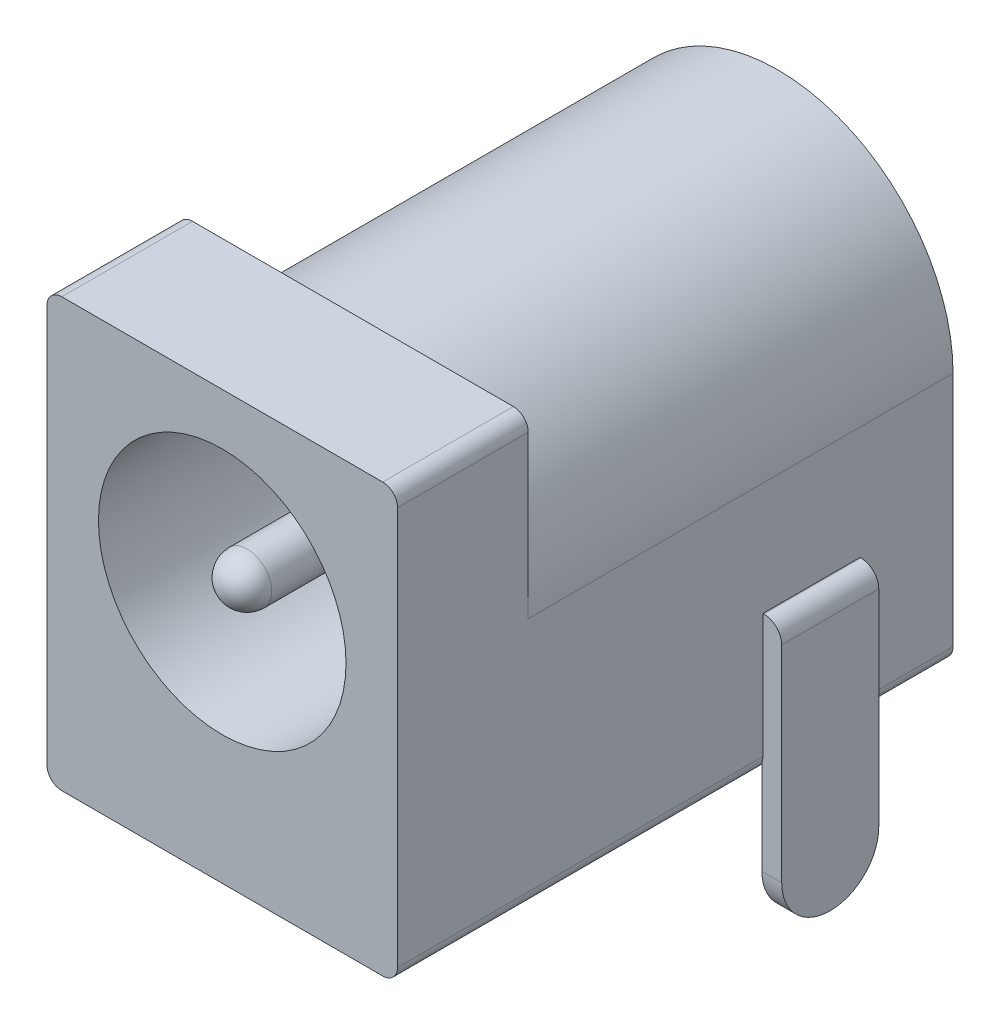
ISO-10303-21;
HEADER;
FILE_DESCRIPTION(('STEP AP214'),'2;1');
FILE_NAME('part.step','',(''),(''),'','','');
FILE_SCHEMA(('AUTOMOTIVE_DESIGN { 1 0 10303 214 1 1 1 1 }'));
ENDSEC;
DATA;
#1=APPLICATION_CONTEXT('core data for automotive mechanical design processes');
#2=APPLICATION_PROTOCOL_DEFINITION('international standard','automotive_design',2000,#1);
#3=PRODUCT_CONTEXT('',#1,'mechanical');
#4=PRODUCT('Part','Part','',(#3));
#5=PRODUCT_RELATED_PRODUCT_CATEGORY('part','',(#4));
#6=PRODUCT_DEFINITION_FORMATION('','',#4);
#7=PRODUCT_DEFINITION_CONTEXT('part definition',#1,'design');
#8=PRODUCT_DEFINITION('design','',#6,#7);
#9=PRODUCT_DEFINITION_SHAPE('','',#8);
#10=(LENGTH_UNIT() NAMED_UNIT(*) SI_UNIT(.MILLI.,.METRE.));
#11=(NAMED_UNIT(*) PLANE_ANGLE_UNIT() SI_UNIT($,.RADIAN.));
#12=(NAMED_UNIT(*) SI_UNIT($,.STERADIAN.) SOLID_ANGLE_UNIT());
#13=UNCERTAINTY_MEASURE_WITH_UNIT(LENGTH_MEASURE(1.E-05),#10,'distance_accuracy_value','');
#14=(GEOMETRIC_REPRESENTATION_CONTEXT(3) GLOBAL_UNCERTAINTY_ASSIGNED_CONTEXT((#13)) GLOBAL_UNIT_ASSIGNED_CONTEXT((#10,
#11,#12)) REPRESENTATION_CONTEXT('',''));
#15=CARTESIAN_POINT('',(0.,0.,0.));
#16=DIRECTION('',(0.,0.,1.));
#17=DIRECTION('',(1.,0.,0.));
#18=AXIS2_PLACEMENT_3D('',#15,#16,#17);
#19=CARTESIAN_POINT('',(8.9662,-3.683,2.3876));
#20=DIRECTION('',(-1.,0.,0.));
#21=DIRECTION('',(0.,0.,1.));
#22=AXIS2_PLACEMENT_3D('',#19,#20,#21);
#23=PLANE('',#22);
#24=DIRECTION('',(0.,1.,0.));
#25=VECTOR('',#24,1.);
#26=CARTESIAN_POINT('',(8.9662,-3.683,2.3876));
#27=LINE('',#26,#25);
#28=CARTESIAN_POINT('',(8.96619999999999,-2.1844,2.3876));
#29=VERTEX_POINT('',#28);
#30=CARTESIAN_POINT('',(8.9662,0.244216813898783,2.3876));
#31=VERTEX_POINT('',#30);
#32=EDGE_CURVE('E229',#29,#31,#27,.T.);
#33=ORIENTED_EDGE('',*,*,#32,.F.);
#34=CARTESIAN_POINT('',(8.96619999999999,-2.1844,3.6322));
#35=DIRECTION('',(1.,0.,0.));
#36=DIRECTION('',(0.,0.,-1.));
#37=AXIS2_PLACEMENT_3D('',#34,#35,#36);
#38=CIRCLE('',#37,1.2446);
#39=CARTESIAN_POINT('',(8.96619999999999,-2.1844,4.8768));
#40=VERTEX_POINT('',#39);
#41=EDGE_CURVE('E216',#40,#29,#38,.T.);
#42=ORIENTED_EDGE('',*,*,#41,.F.);
#43=DIRECTION('',(0.,1.,0.));
#44=VECTOR('',#43,1.);
#45=CARTESIAN_POINT('',(8.9662,-3.683,4.8768));
#46=LINE('',#45,#44);
#47=CARTESIAN_POINT('',(8.9662,0.244216813898783,4.8768));
#48=VERTEX_POINT('',#47);
#49=EDGE_CURVE('E249',#40,#48,#46,.T.);
#50=ORIENTED_EDGE('',*,*,#49,.T.);
#51=DIRECTION('',(0.,0.,-1.));
#52=VECTOR('',#51,1.);
#53=CARTESIAN_POINT('',(8.9662,0.244216813898783,14.2494));
#54=LINE('',#53,#52);
#55=EDGE_CURVE('E236',#31,#48,#54,.F.);
#56=ORIENTED_EDGE('',*,*,#55,.F.);
#57=EDGE_LOOP('',(#33,#42,#50,#56));
#58=FACE_BOUND('',#57,.T.);
#59=ADVANCED_FACE('F40',(#58),#23,.T.);
#60=CARTESIAN_POINT('',(8.9662,-3.683,2.3876));
#61=DIRECTION('',(0.,0.,1.));
#62=DIRECTION('',(1.,0.,0.));
#63=AXIS2_PLACEMENT_3D('',#60,#61,#62);
#64=PLANE('',#63);
#65=DIRECTION('',(1.,0.,0.));
#66=VECTOR('',#65,1.);
#67=CARTESIAN_POINT('',(8.96619999999999,-2.1844,2.3876));
#68=LINE('',#67,#66);
#69=CARTESIAN_POINT('',(9.47419999999999,-2.1844,2.3876));
#70=VERTEX_POINT('',#69);
#71=EDGE_CURVE('E55',#29,#70,#68,.T.);
#72=ORIENTED_EDGE('',*,*,#71,.F.);
#73=ORIENTED_EDGE('',*,*,#32,.T.);
#74=CARTESIAN_POINT('',(8.6106,0.380999999999999,2.3876));
#75=DIRECTION('',(0.,0.,1.));
#76=DIRECTION('',(1.,0.,0.));
#77=AXIS2_PLACEMENT_3D('',#74,#75,#76);
#78=CIRCLE('',#77,0.380999999999999);
#79=CARTESIAN_POINT('',(8.99159999999999,0.380999999999999,2.3876));
#80=VERTEX_POINT('',#79);
#81=EDGE_CURVE('E240',#31,#80,#78,.T.);
#82=ORIENTED_EDGE('',*,*,#81,.T.);
#83=DIRECTION('',(0.,-1.,0.));
#84=VECTOR('',#83,1.);
#85=CARTESIAN_POINT('',(8.9916,10.5918,2.3876));
#86=LINE('',#85,#84);
#87=CARTESIAN_POINT('',(8.9916,3.556,2.3876));
#88=VERTEX_POINT('',#87);
#89=EDGE_CURVE('E347',#88,#80,#86,.T.);
#90=ORIENTED_EDGE('',*,*,#89,.F.);
#91=DIRECTION('',(1.,0.,0.));
#92=VECTOR('',#91,1.);
#93=CARTESIAN_POINT('',(8.9662,3.556,2.3876));
#94=LINE('',#93,#92);
#95=CARTESIAN_POINT('',(9.017,3.556,2.3876));
#96=VERTEX_POINT('',#95);
#97=EDGE_CURVE('E245',#88,#96,#94,.T.);
#98=ORIENTED_EDGE('',*,*,#97,.T.);
#99=CARTESIAN_POINT('',(9.017,3.0988,2.3876));
#100=DIRECTION('',(0.,0.,1.));
#101=DIRECTION('',(1.,0.,0.));
#102=AXIS2_PLACEMENT_3D('',#99,#100,#101);
#103=CIRCLE('',#102,0.4572);
#104=CARTESIAN_POINT('',(9.47419999999999,3.0988,2.3876));
#105=VERTEX_POINT('',#104);
#106=EDGE_CURVE('E383',#96,#105,#103,.F.);
#107=ORIENTED_EDGE('',*,*,#106,.T.);
#108=DIRECTION('',(0.,1.,0.));
#109=VECTOR('',#108,1.);
#110=CARTESIAN_POINT('',(9.47419999999999,-3.683,2.3876));
#111=LINE('',#110,#109);
#112=EDGE_CURVE('E232',#70,#105,#111,.T.);
#113=ORIENTED_EDGE('',*,*,#112,.F.);
#114=EDGE_LOOP('',(#72,#73,#82,#90,#98,#107,#113));
#115=FACE_BOUND('',#114,.T.);
#116=ADVANCED_FACE('F227',(#115),#64,.F.);
#117=CARTESIAN_POINT('',(9.47419999999999,-3.683,4.8768));
#118=DIRECTION('',(1.,0.,0.));
#119=DIRECTION('',(0.,0.,-1.));
#120=AXIS2_PLACEMENT_3D('',#117,#118,#119);
#121=PLANE('',#120);
#122=DIRECTION('',(0.,1.,0.));
#123=VECTOR('',#122,1.);
#124=CARTESIAN_POINT('',(9.47419999999999,-3.683,4.8768));
#125=LINE('',#124,#123);
#126=CARTESIAN_POINT('',(9.47419999999999,-2.1844,4.8768));
#127=VERTEX_POINT('',#126);
#128=CARTESIAN_POINT('',(9.47419999999999,3.0988,4.8768));
#129=VERTEX_POINT('',#128);
#130=EDGE_CURVE('E242',#127,#129,#125,.T.);
#131=ORIENTED_EDGE('',*,*,#130,.F.);
#132=CARTESIAN_POINT('',(9.47419999999999,-2.1844,3.6322));
#133=DIRECTION('',(1.,0.,0.));
#134=DIRECTION('',(0.,0.,-1.));
#135=AXIS2_PLACEMENT_3D('',#132,#133,#134);
#136=CIRCLE('',#135,1.2446);
#137=EDGE_CURVE('E223',#127,#70,#136,.T.);
#138=ORIENTED_EDGE('',*,*,#137,.T.);
#139=ORIENTED_EDGE('',*,*,#112,.T.);
#140=DIRECTION('',(0.,0.,-1.));
#141=VECTOR('',#140,1.);
#142=CARTESIAN_POINT('',(9.47419999999999,3.0988,4.8768));
#143=LINE('',#142,#141);
#144=EDGE_CURVE('E385',#105,#129,#143,.F.);
#145=ORIENTED_EDGE('',*,*,#144,.T.);
#146=EDGE_LOOP('',(#131,#138,#139,#145));
#147=FACE_BOUND('',#146,.T.);
#148=ADVANCED_FACE('F444',(#147),#121,.T.);
#149=CARTESIAN_POINT('',(5.7404,-3.683,7.0104));
#150=DIRECTION('',(1.,0.,0.));
#151=DIRECTION('',(0.,0.,-1.));
#152=AXIS2_PLACEMENT_3D('',#149,#150,#151);
#153=PLANE('',#152);
#154=DIRECTION('',(0.,1.,0.));
#155=VECTOR('',#154,1.);
#156=CARTESIAN_POINT('',(5.7404,-3.683,7.0104));
#157=LINE('',#156,#155);
#158=CARTESIAN_POINT('',(5.7404,-2.1844,7.0104));
#159=VERTEX_POINT('',#158);
#160=CARTESIAN_POINT('',(5.7404,0.,7.0104));
#161=VERTEX_POINT('',#160);
#162=EDGE_CURVE('E474',#159,#161,#157,.T.);
#163=ORIENTED_EDGE('',*,*,#162,.F.);
#164=DIRECTION('',(0.,0.,-1.));
#165=VECTOR('',#164,1.);
#166=CARTESIAN_POINT('',(5.7404,-2.1844,7.26440000002886));
#167=LINE('',#166,#165);
#168=CARTESIAN_POINT('',(5.7404,-2.1844,6.75640000002886));
#169=VERTEX_POINT('',#168);
#170=EDGE_CURVE('E62',#159,#169,#167,.T.);
#171=ORIENTED_EDGE('',*,*,#170,.T.);
#172=DIRECTION('',(0.,1.,0.));
#173=VECTOR('',#172,1.);
#174=CARTESIAN_POINT('',(5.7404,-3.683,6.7564));
#175=LINE('',#174,#173);
#176=CARTESIAN_POINT('',(5.7404,0.,6.7564));
#177=VERTEX_POINT('',#176);
#178=EDGE_CURVE('E472',#169,#177,#175,.T.);
#179=ORIENTED_EDGE('',*,*,#178,.T.);
#180=DIRECTION('',(0.,0.,-1.));
#181=VECTOR('',#180,1.);
#182=CARTESIAN_POINT('',(5.74040000000005,0.,14.2494));
#183=LINE('',#182,#181);
#184=EDGE_CURVE('E374',#161,#177,#183,.T.);
#185=ORIENTED_EDGE('',*,*,#184,.F.);
#186=EDGE_LOOP('',(#163,#171,#179,#185));
#187=FACE_BOUND('',#186,.T.);
#188=ADVANCED_FACE('F606',(#187),#153,.T.);
#189=CARTESIAN_POINT('',(3.2512,-3.683,6.7564));
#190=DIRECTION('',(0.,0.,1.));
#191=DIRECTION('',(1.,0.,0.));
#192=AXIS2_PLACEMENT_3D('',#189,#190,#191);
#193=PLANE('',#192);
#194=CARTESIAN_POINT('',(4.4958,-2.1844,6.75640000002886));
#195=DIRECTION('',(0.,0.,-1.));
#196=DIRECTION('',(-1.,0.,0.));
#197=AXIS2_PLACEMENT_3D('',#194,#195,#196);
#198=CIRCLE('',#197,1.2446);
#199=CARTESIAN_POINT('',(3.2512,-2.1844,6.75640000002886));
#200=VERTEX_POINT('',#199);
#201=EDGE_CURVE('E441',#169,#200,#198,.T.);
#202=ORIENTED_EDGE('',*,*,#201,.T.);
#203=DIRECTION('',(0.,1.,0.));
#204=VECTOR('',#203,1.);
#205=CARTESIAN_POINT('',(3.2512,-3.683,6.7564));
#206=LINE('',#205,#204);
#207=CARTESIAN_POINT('',(3.2512,0.,6.7564));
#208=VERTEX_POINT('',#207);
#209=EDGE_CURVE('E469',#200,#208,#206,.T.);
#210=ORIENTED_EDGE('',*,*,#209,.T.);
#211=DIRECTION('',(1.,0.,0.));
#212=VECTOR('',#211,1.);
#213=CARTESIAN_POINT('',(0.381,0.,6.7564));
#214=LINE('',#213,#212);
#215=EDGE_CURVE('E479',#208,#177,#214,.T.);
#216=ORIENTED_EDGE('',*,*,#215,.T.);
#217=ORIENTED_EDGE('',*,*,#178,.F.);
#218=EDGE_LOOP('',(#202,#210,#216,#217));
#219=FACE_BOUND('',#218,.T.);
#220=ADVANCED_FACE('F595',(#219),#193,.F.);
#221=CARTESIAN_POINT('',(5.7404,-3.683,7.0104));
#222=DIRECTION('',(0.,0.,-1.));
#223=DIRECTION('',(-1.,0.,0.));
#224=AXIS2_PLACEMENT_3D('',#221,#222,#223);
#225=PLANE('',#224);
#226=CARTESIAN_POINT('',(4.4958,-2.1844,7.0104));
#227=DIRECTION('',(0.,0.,-1.));
#228=DIRECTION('',(-1.,0.,0.));
#229=AXIS2_PLACEMENT_3D('',#226,#227,#228);
#230=CIRCLE('',#229,1.2446);
#231=CARTESIAN_POINT('',(3.2512,-2.1844,7.0104));
#232=VERTEX_POINT('',#231);
#233=EDGE_CURVE('E12',#159,#232,#230,.T.);
#234=ORIENTED_EDGE('',*,*,#233,.F.);
#235=ORIENTED_EDGE('',*,*,#162,.T.);
#236=DIRECTION('',(-1.,0.,0.));
#237=VECTOR('',#236,1.);
#238=CARTESIAN_POINT('',(0.381,0.,7.0104));
#239=LINE('',#238,#237);
#240=CARTESIAN_POINT('',(3.2512,0.,7.0104));
#241=VERTEX_POINT('',#240);
#242=EDGE_CURVE('E471',#161,#241,#239,.T.);
#243=ORIENTED_EDGE('',*,*,#242,.T.);
#244=DIRECTION('',(0.,1.,0.));
#245=VECTOR('',#244,1.);
#246=CARTESIAN_POINT('',(3.2512,-3.683,7.0104));
#247=LINE('',#246,#245);
#248=EDGE_CURVE('E468',#232,#241,#247,.T.);
#249=ORIENTED_EDGE('',*,*,#248,.F.);
#250=EDGE_LOOP('',(#234,#235,#243,#249));
#251=FACE_BOUND('',#250,.T.);
#252=ADVANCED_FACE('F603',(#251),#225,.F.);
#253=CARTESIAN_POINT('',(2.9972,-3.683,0.381000000000002));
#254=DIRECTION('',(0.,0.,1.));
#255=DIRECTION('',(1.,0.,0.));
#256=AXIS2_PLACEMENT_3D('',#253,#254,#255);
#257=PLANE('',#256);
#258=CARTESIAN_POINT('',(4.4958,-1.9304,0.381000000000002));
#259=DIRECTION('',(0.,0.,-1.));
#260=DIRECTION('',(-1.,0.,0.));
#261=AXIS2_PLACEMENT_3D('',#258,#259,#260);
#262=CIRCLE('',#261,1.4986);
#263=CARTESIAN_POINT('',(5.9944,-1.9304,0.381000000000002));
#264=VERTEX_POINT('',#263);
#265=CARTESIAN_POINT('',(2.9972,-1.9304,0.381000000000002));
#266=VERTEX_POINT('',#265);
#267=EDGE_CURVE('E452',#264,#266,#262,.T.);
#268=ORIENTED_EDGE('',*,*,#267,.T.);
#269=DIRECTION('',(0.,1.,0.));
#270=VECTOR('',#269,1.);
#271=CARTESIAN_POINT('',(2.9972,-3.683,0.381000000000002));
#272=LINE('',#271,#270);
#273=CARTESIAN_POINT('',(2.9972,0.,0.381000000000002));
#274=VERTEX_POINT('',#273);
#275=EDGE_CURVE('E401',#266,#274,#272,.T.);
#276=ORIENTED_EDGE('',*,*,#275,.T.);
#277=DIRECTION('',(1.,0.,0.));
#278=VECTOR('',#277,1.);
#279=CARTESIAN_POINT('',(0.381,0.,0.381000000000002));
#280=LINE('',#279,#278);
#281=CARTESIAN_POINT('',(5.9944,0.,0.381000000000002));
#282=VERTEX_POINT('',#281);
#283=EDGE_CURVE('E356',#274,#282,#280,.T.);
#284=ORIENTED_EDGE('',*,*,#283,.T.);
#285=DIRECTION('',(0.,1.,0.));
#286=VECTOR('',#285,1.);
#287=CARTESIAN_POINT('',(5.9944,-3.683,0.381000000000002));
#288=LINE('',#287,#286);
#289=EDGE_CURVE('E484',#264,#282,#288,.T.);
#290=ORIENTED_EDGE('',*,*,#289,.F.);
#291=EDGE_LOOP('',(#268,#276,#284,#290));
#292=FACE_BOUND('',#291,.T.);
#293=ADVANCED_FACE('F508',(#292),#257,.F.);
#294=CARTESIAN_POINT('',(5.9944,-3.683,0.889000000000002));
#295=DIRECTION('',(1.,0.,0.));
#296=DIRECTION('',(0.,0.,-1.));
#297=AXIS2_PLACEMENT_3D('',#294,#295,#296);
#298=PLANE('',#297);
#299=DIRECTION('',(0.,1.,0.));
#300=VECTOR('',#299,1.);
#301=CARTESIAN_POINT('',(5.9944,-3.683,0.889000000000002));
#302=LINE('',#301,#300);
#303=CARTESIAN_POINT('',(5.9944,-1.9304,0.889000000000002));
#304=VERTEX_POINT('',#303);
#305=CARTESIAN_POINT('',(5.9944,0.,0.889000000000002));
#306=VERTEX_POINT('',#305);
#307=EDGE_CURVE('E486',#304,#306,#302,.T.);
#308=ORIENTED_EDGE('',*,*,#307,.F.);
#309=DIRECTION('',(0.,0.,-1.));
#310=VECTOR('',#309,1.);
#311=CARTESIAN_POINT('',(5.9944,-1.9304,0.889000000000003));
#312=LINE('',#311,#310);
#313=EDGE_CURVE('E455',#304,#264,#312,.T.);
#314=ORIENTED_EDGE('',*,*,#313,.T.);
#315=ORIENTED_EDGE('',*,*,#289,.T.);
#316=DIRECTION('',(0.,0.,-1.));
#317=VECTOR('',#316,1.);
#318=CARTESIAN_POINT('',(5.9944,0.,14.2494));
#319=LINE('',#318,#317);
#320=EDGE_CURVE('E353',#306,#282,#319,.T.);
#321=ORIENTED_EDGE('',*,*,#320,.F.);
#322=EDGE_LOOP('',(#308,#314,#315,#321));
#323=FACE_BOUND('',#322,.T.);
#324=ADVANCED_FACE('F505',(#323),#298,.T.);
#325=CARTESIAN_POINT('',(5.9944,-3.683,0.889000000000002));
#326=DIRECTION('',(0.,0.,-1.));
#327=DIRECTION('',(-1.,0.,0.));
#328=AXIS2_PLACEMENT_3D('',#325,#326,#327);
#329=PLANE('',#328);
#330=CARTESIAN_POINT('',(4.4958,-1.9304,0.889000000000003));
#331=DIRECTION('',(0.,0.,-1.));
#332=DIRECTION('',(-1.,0.,0.));
#333=AXIS2_PLACEMENT_3D('',#330,#331,#332);
#334=CIRCLE('',#333,1.4986);
#335=CARTESIAN_POINT('',(2.9972,-1.9304,0.889000000000003));
#336=VERTEX_POINT('',#335);
#337=EDGE_CURVE('E453',#304,#336,#334,.T.);
#338=ORIENTED_EDGE('',*,*,#337,.F.);
#339=ORIENTED_EDGE('',*,*,#307,.T.);
#340=DIRECTION('',(-1.,0.,0.));
#341=VECTOR('',#340,1.);
#342=CARTESIAN_POINT('',(0.380999999999999,0.,0.889000000000003));
#343=LINE('',#342,#341);
#344=CARTESIAN_POINT('',(2.9972,0.,0.889000000000003));
#345=VERTEX_POINT('',#344);
#346=EDGE_CURVE('E350',#306,#345,#343,.T.);
#347=ORIENTED_EDGE('',*,*,#346,.T.);
#348=DIRECTION('',(0.,1.,0.));
#349=VECTOR('',#348,1.);
#350=CARTESIAN_POINT('',(2.9972,-3.683,0.889000000000003));
#351=LINE('',#350,#349);
#352=EDGE_CURVE('E482',#336,#345,#351,.T.);
#353=ORIENTED_EDGE('',*,*,#352,.F.);
#354=EDGE_LOOP('',(#338,#339,#347,#353));
#355=FACE_BOUND('',#354,.T.);
#356=ADVANCED_FACE('F502',(#355),#329,.F.);
#357=CARTESIAN_POINT('',(4.4958,6.477,2.54));
#358=DIRECTION('',(0.,0.,1.));
#359=DIRECTION('',(1.,0.,0.));
#360=AXIS2_PLACEMENT_3D('',#357,#358,#359);
#361=CYLINDRICAL_SURFACE('',#360,3.175);
#362=CARTESIAN_POINT('',(4.4958,6.477,14.2494));
#363=DIRECTION('',(0.,0.,1.));
#364=DIRECTION('',(1.,0.,0.));
#365=AXIS2_PLACEMENT_3D('',#362,#363,#364);
#366=CIRCLE('',#365,3.175);
#367=CARTESIAN_POINT('',(7.6708,6.477,14.2494));
#368=VERTEX_POINT('',#367);
#369=EDGE_CURVE('E276',#368,#368,#366,.T.);
#370=ORIENTED_EDGE('',*,*,#369,.T.);
#371=EDGE_LOOP('',(#370));
#372=FACE_BOUND('',#371,.T.);
#373=CARTESIAN_POINT('',(4.4958,6.477,2.54));
#374=DIRECTION('',(0.,0.,1.));
#375=DIRECTION('',(1.,0.,0.));
#376=AXIS2_PLACEMENT_3D('',#373,#374,#375);
#377=CIRCLE('',#376,3.175);
#378=CARTESIAN_POINT('',(7.6708,6.477,2.54));
#379=VERTEX_POINT('',#378);
#380=EDGE_CURVE('E277',#379,#379,#377,.T.);
#381=ORIENTED_EDGE('',*,*,#380,.F.);
#382=EDGE_LOOP('',(#381));
#383=FACE_BOUND('',#382,.T.);
#384=DIRECTION('',(0.,0.,1.));
#385=VECTOR('',#384,1.);
#386=CARTESIAN_POINT('',(5.74014078933385,3.556,2.54));
#387=LINE('',#386,#385);
#388=CARTESIAN_POINT('',(5.74014078933385,3.556,7.0104));
#389=VERTEX_POINT('',#388);
#390=CARTESIAN_POINT('',(5.74014078933385,3.556,6.7564));
#391=VERTEX_POINT('',#390);
#392=EDGE_CURVE('E371',#389,#391,#387,.F.);
#393=ORIENTED_EDGE('',*,*,#392,.F.);
#394=CARTESIAN_POINT('',(4.4958,6.477,7.0104));
#395=DIRECTION('',(0.,0.,-1.));
#396=DIRECTION('',(-1.,0.,0.));
#397=AXIS2_PLACEMENT_3D('',#394,#395,#396);
#398=CIRCLE('',#397,3.175);
#399=CARTESIAN_POINT('',(3.25145921066615,3.556,7.0104));
#400=VERTEX_POINT('',#399);
#401=EDGE_CURVE('E365',#400,#389,#398,.F.);
#402=ORIENTED_EDGE('',*,*,#401,.F.);
#403=DIRECTION('',(0.,0.,1.));
#404=VECTOR('',#403,1.);
#405=CARTESIAN_POINT('',(3.25145921066615,3.556,2.54));
#406=LINE('',#405,#404);
#407=CARTESIAN_POINT('',(3.25145921066615,3.556,6.7564));
#408=VERTEX_POINT('',#407);
#409=EDGE_CURVE('E362',#408,#400,#406,.T.);
#410=ORIENTED_EDGE('',*,*,#409,.F.);
#411=CARTESIAN_POINT('',(4.4958,6.477,6.7564));
#412=DIRECTION('',(0.,0.,1.));
#413=DIRECTION('',(1.,0.,0.));
#414=AXIS2_PLACEMENT_3D('',#411,#412,#413);
#415=CIRCLE('',#414,3.175);
#416=EDGE_CURVE('E368',#391,#408,#415,.F.);
#417=ORIENTED_EDGE('',*,*,#416,.F.);
#418=EDGE_LOOP('',(#393,#402,#410,#417));
#419=FACE_BOUND('',#418,.T.);
#420=ADVANCED_FACE('F543',(#372,#383,#419),#361,.F.);
#421=CARTESIAN_POINT('',(8.6106,0.380999999999999,14.2494));
#422=DIRECTION('',(0.,0.,-1.));
#423=DIRECTION('',(-1.,0.,0.));
#424=AXIS2_PLACEMENT_3D('',#421,#422,#423);
#425=CYLINDRICAL_SURFACE('',#424,0.380999999999999);
#426=ORIENTED_EDGE('',*,*,#81,.F.);
#427=ORIENTED_EDGE('',*,*,#55,.T.);
#428=CARTESIAN_POINT('',(8.6106,0.380999999999999,4.8768));
#429=DIRECTION('',(0.,0.,-1.));
#430=DIRECTION('',(-1.,0.,0.));
#431=AXIS2_PLACEMENT_3D('',#428,#429,#430);
#432=CIRCLE('',#431,0.380999999999999);
#433=CARTESIAN_POINT('',(8.99159999999999,0.380999999999999,4.8768));
#434=VERTEX_POINT('',#433);
#435=EDGE_CURVE('E237',#434,#48,#432,.T.);
#436=ORIENTED_EDGE('',*,*,#435,.F.);
#437=DIRECTION('',(0.,0.,-1.));
#438=VECTOR('',#437,1.);
#439=CARTESIAN_POINT('',(8.99159999999999,0.380999999999999,14.2494));
#440=LINE('',#439,#438);
#441=CARTESIAN_POINT('',(8.99159999999999,0.380999999999999,14.2494));
#442=VERTEX_POINT('',#441);
#443=EDGE_CURVE('E325',#442,#434,#440,.T.);
#444=ORIENTED_EDGE('',*,*,#443,.F.);
#445=CARTESIAN_POINT('',(8.6106,0.380999999999999,14.2494));
#446=DIRECTION('',(0.,0.,1.));
#447=DIRECTION('',(1.,0.,0.));
#448=AXIS2_PLACEMENT_3D('',#445,#446,#447);
#449=CIRCLE('',#448,0.380999999999999);
#450=CARTESIAN_POINT('',(8.6106,0.,14.2494));
#451=VERTEX_POINT('',#450);
#452=EDGE_CURVE('E294',#451,#442,#449,.T.);
#453=ORIENTED_EDGE('',*,*,#452,.F.);
#454=DIRECTION('',(0.,0.,-1.));
#455=VECTOR('',#454,1.);
#456=CARTESIAN_POINT('',(8.6106,0.,14.2494));
#457=LINE('',#456,#455);
#458=CARTESIAN_POINT('',(8.6106,0.,0.));
#459=VERTEX_POINT('',#458);
#460=EDGE_CURVE('E328',#451,#459,#457,.T.);
#461=ORIENTED_EDGE('',*,*,#460,.T.);
#462=CARTESIAN_POINT('',(8.6106,0.380999999999999,0.));
#463=DIRECTION('',(0.,0.,1.));
#464=DIRECTION('',(1.,0.,0.));
#465=AXIS2_PLACEMENT_3D('',#462,#463,#464);
#466=CIRCLE('',#465,0.380999999999999);
#467=CARTESIAN_POINT('',(8.99159999999999,0.380999999999999,0.));
#468=VERTEX_POINT('',#467);
#469=EDGE_CURVE('E311',#459,#468,#466,.T.);
#470=ORIENTED_EDGE('',*,*,#469,.T.);
#471=EDGE_CURVE('E324',#80,#468,#440,.T.);
#472=ORIENTED_EDGE('',*,*,#471,.F.);
#473=EDGE_LOOP('',(#426,#427,#436,#444,#453,#461,#470,#472));
#474=FACE_BOUND('',#473,.T.);
#475=ADVANCED_FACE('F408',(#474),#425,.T.);
#476=CARTESIAN_POINT('',(8.9916,10.5918,14.2494));
#477=DIRECTION('',(1.,0.,0.));
#478=DIRECTION('',(0.,1.,0.));
#479=AXIS2_PLACEMENT_3D('',#476,#477,#478);
#480=PLANE('',#479);
#481=DIRECTION('',(0.,0.,1.));
#482=VECTOR('',#481,1.);
#483=CARTESIAN_POINT('',(8.9916,3.556,14.2494));
#484=LINE('',#483,#482);
#485=CARTESIAN_POINT('',(8.9916,3.556,4.8768));
#486=VERTEX_POINT('',#485);
#487=EDGE_CURVE('E341',#88,#486,#484,.T.);
#488=ORIENTED_EDGE('',*,*,#487,.F.);
#489=ORIENTED_EDGE('',*,*,#89,.T.);
#490=ORIENTED_EDGE('',*,*,#471,.T.);
#491=DIRECTION('',(0.,-1.,0.));
#492=VECTOR('',#491,1.);
#493=CARTESIAN_POINT('',(8.9916,10.5918,0.));
#494=LINE('',#493,#492);
#495=CARTESIAN_POINT('',(8.9916,6.4516,0.));
#496=VERTEX_POINT('',#495);
#497=EDGE_CURVE('E286',#496,#468,#494,.T.);
#498=ORIENTED_EDGE('',*,*,#497,.F.);
#499=DIRECTION('',(0.,0.,-1.));
#500=VECTOR('',#499,1.);
#501=CARTESIAN_POINT('',(8.9916,6.4516,24.3136992801287));
#502=LINE('',#501,#500);
#503=CARTESIAN_POINT('',(8.9916,6.4516,10.8966));
#504=VERTEX_POINT('',#503);
#505=EDGE_CURVE('E265',#504,#496,#502,.T.);
#506=ORIENTED_EDGE('',*,*,#505,.F.);
#507=DIRECTION('',(0.,-1.,0.));
#508=VECTOR('',#507,1.);
#509=CARTESIAN_POINT('',(8.9916,10.5918,10.8966));
#510=LINE('',#509,#508);
#511=CARTESIAN_POINT('',(8.9916,10.5918,10.8966));
#512=VERTEX_POINT('',#511);
#513=EDGE_CURVE('E262',#512,#504,#510,.T.);
#514=ORIENTED_EDGE('',*,*,#513,.F.);
#515=DIRECTION('',(0.,0.,-1.));
#516=VECTOR('',#515,1.);
#517=CARTESIAN_POINT('',(8.9916,10.5918,14.2494));
#518=LINE('',#517,#516);
#519=CARTESIAN_POINT('',(8.9916,10.5918,14.2494));
#520=VERTEX_POINT('',#519);
#521=EDGE_CURVE('E321',#520,#512,#518,.T.);
#522=ORIENTED_EDGE('',*,*,#521,.F.);
#523=DIRECTION('',(0.,-1.,0.));
#524=VECTOR('',#523,1.);
#525=CARTESIAN_POINT('',(8.9916,10.5918,14.2494));
#526=LINE('',#525,#524);
#527=EDGE_CURVE('E296',#520,#442,#526,.T.);
#528=ORIENTED_EDGE('',*,*,#527,.T.);
#529=ORIENTED_EDGE('',*,*,#443,.T.);
#530=DIRECTION('',(0.,1.,0.));
#531=VECTOR('',#530,1.);
#532=CARTESIAN_POINT('',(8.9916,10.5918,4.8768));
#533=LINE('',#532,#531);
#534=EDGE_CURVE('E344',#434,#486,#533,.T.);
#535=ORIENTED_EDGE('',*,*,#534,.T.);
#536=EDGE_LOOP('',(#488,#489,#490,#498,#506,#514,#522,#528,#529,#535));
#537=FACE_BOUND('',#536,.T.);
#538=ADVANCED_FACE('F405',(#537),#480,.T.);
#539=CARTESIAN_POINT('',(0.381,10.5918,0.));
#540=DIRECTION('',(0.,0.,1.));
#541=DIRECTION('',(1.,0.,0.));
#542=AXIS2_PLACEMENT_3D('',#539,#540,#541);
#543=PLANE('',#542);
#544=CARTESIAN_POINT('',(4.4958,6.4516,0.));
#545=DIRECTION('',(0.,0.,-1.));
#546=DIRECTION('',(-1.,0.,0.));
#547=AXIS2_PLACEMENT_3D('',#544,#545,#546);
#548=CIRCLE('',#547,4.4958);
#549=CARTESIAN_POINT('',(0.,6.4516,0.));
#550=VERTEX_POINT('',#549);
#551=EDGE_CURVE('E253',#550,#496,#548,.T.);
#552=ORIENTED_EDGE('',*,*,#551,.T.);
#553=ORIENTED_EDGE('',*,*,#497,.T.);
#554=ORIENTED_EDGE('',*,*,#469,.F.);
#555=DIRECTION('',(1.,0.,0.));
#556=VECTOR('',#555,1.);
#557=CARTESIAN_POINT('',(0.381,0.,0.));
#558=LINE('',#557,#556);
#559=CARTESIAN_POINT('',(0.381,0.,0.));
#560=VERTEX_POINT('',#559);
#561=EDGE_CURVE('E309',#560,#459,#558,.T.);
#562=ORIENTED_EDGE('',*,*,#561,.F.);
#563=CARTESIAN_POINT('',(0.381,0.381,0.));
#564=DIRECTION('',(0.,0.,-1.));
#565=DIRECTION('',(-1.,0.,0.));
#566=AXIS2_PLACEMENT_3D('',#563,#564,#565);
#567=CIRCLE('',#566,0.381);
#568=CARTESIAN_POINT('',(0.,0.381,0.));
#569=VERTEX_POINT('',#568);
#570=EDGE_CURVE('E306',#560,#569,#567,.T.);
#571=ORIENTED_EDGE('',*,*,#570,.T.);
#572=DIRECTION('',(0.,1.,0.));
#573=VECTOR('',#572,1.);
#574=CARTESIAN_POINT('',(0.,0.381,0.));
#575=LINE('',#574,#573);
#576=EDGE_CURVE('E280',#569,#550,#575,.T.);
#577=ORIENTED_EDGE('',*,*,#576,.T.);
#578=EDGE_LOOP('',(#552,#553,#554,#562,#571,#577));
#579=FACE_BOUND('',#578,.T.);
#580=ADVANCED_FACE('F414',(#579),#543,.F.);
#581=CARTESIAN_POINT('',(0.381,10.5918,14.2494));
#582=DIRECTION('',(0.,0.,-1.));
#583=DIRECTION('',(-1.,0.,0.));
#584=AXIS2_PLACEMENT_3D('',#581,#582,#583);
#585=CYLINDRICAL_SURFACE('',#584,0.381);
#586=DIRECTION('',(0.,0.,-1.));
#587=VECTOR('',#586,1.);
#588=CARTESIAN_POINT('',(0.381,10.9728,14.2494));
#589=LINE('',#588,#587);
#590=CARTESIAN_POINT('',(0.381,10.9728,14.2494));
#591=VERTEX_POINT('',#590);
#592=CARTESIAN_POINT('',(0.381,10.9728,10.8966));
#593=VERTEX_POINT('',#592);
#594=EDGE_CURVE('E303',#591,#593,#589,.T.);
#595=ORIENTED_EDGE('',*,*,#594,.T.);
#596=CARTESIAN_POINT('',(0.381,10.5918,10.8966));
#597=DIRECTION('',(0.,0.,1.));
#598=DIRECTION('',(1.,0.,0.));
#599=AXIS2_PLACEMENT_3D('',#596,#597,#598);
#600=CIRCLE('',#599,0.381);
#601=CARTESIAN_POINT('',(0.,10.5918,10.8966));
#602=VERTEX_POINT('',#601);
#603=EDGE_CURVE('E260',#602,#593,#600,.F.);
#604=ORIENTED_EDGE('',*,*,#603,.F.);
#605=DIRECTION('',(0.,0.,-1.));
#606=VECTOR('',#605,1.);
#607=CARTESIAN_POINT('',(0.,10.5918,14.2494));
#608=LINE('',#607,#606);
#609=CARTESIAN_POINT('',(0.,10.5918,14.2494));
#610=VERTEX_POINT('',#609);
#611=EDGE_CURVE('E335',#610,#602,#608,.T.);
#612=ORIENTED_EDGE('',*,*,#611,.F.);
#613=CARTESIAN_POINT('',(0.381,10.5918,14.2494));
#614=DIRECTION('',(0.,0.,1.));
#615=DIRECTION('',(1.,0.,0.));
#616=AXIS2_PLACEMENT_3D('',#613,#614,#615);
#617=CIRCLE('',#616,0.381);
#618=EDGE_CURVE('E283',#591,#610,#617,.T.);
#619=ORIENTED_EDGE('',*,*,#618,.F.);
#620=EDGE_LOOP('',(#595,#604,#612,#619));
#621=FACE_BOUND('',#620,.T.);
#622=ADVANCED_FACE('F552',(#621),#585,.T.);
#623=CARTESIAN_POINT('',(0.,0.381,14.2494));
#624=DIRECTION('',(-1.,0.,0.));
#625=DIRECTION('',(0.,-1.,0.));
#626=AXIS2_PLACEMENT_3D('',#623,#624,#625);
#627=PLANE('',#626);
#628=DIRECTION('',(0.,1.,0.));
#629=VECTOR('',#628,1.);
#630=CARTESIAN_POINT('',(0.,6.4516,10.8966));
#631=LINE('',#630,#629);
#632=CARTESIAN_POINT('',(0.,6.4516,10.8966));
#633=VERTEX_POINT('',#632);
#634=EDGE_CURVE('E258',#633,#602,#631,.T.);
#635=ORIENTED_EDGE('',*,*,#634,.F.);
#636=DIRECTION('',(0.,0.,-1.));
#637=VECTOR('',#636,1.);
#638=CARTESIAN_POINT('',(0.,6.4516,24.3136992801287));
#639=LINE('',#638,#637);
#640=EDGE_CURVE('E257',#633,#550,#639,.T.);
#641=ORIENTED_EDGE('',*,*,#640,.T.);
#642=ORIENTED_EDGE('',*,*,#576,.F.);
#643=DIRECTION('',(0.,0.,-1.));
#644=VECTOR('',#643,1.);
#645=CARTESIAN_POINT('',(0.,0.381,14.2494));
#646=LINE('',#645,#644);
#647=CARTESIAN_POINT('',(0.,0.381,14.2494));
#648=VERTEX_POINT('',#647);
#649=EDGE_CURVE('E333',#648,#569,#646,.T.);
#650=ORIENTED_EDGE('',*,*,#649,.F.);
#651=DIRECTION('',(0.,1.,0.));
#652=VECTOR('',#651,1.);
#653=CARTESIAN_POINT('',(0.,0.381,14.2494));
#654=LINE('',#653,#652);
#655=EDGE_CURVE('E285',#648,#610,#654,.T.);
#656=ORIENTED_EDGE('',*,*,#655,.T.);
#657=ORIENTED_EDGE('',*,*,#611,.T.);
#658=EDGE_LOOP('',(#635,#641,#642,#650,#656,#657));
#659=FACE_BOUND('',#658,.T.);
#660=ADVANCED_FACE('F567',(#659),#627,.T.);
#661=CARTESIAN_POINT('',(0.381,0.381,14.2494));
#662=DIRECTION('',(0.,0.,-1.));
#663=DIRECTION('',(-1.,0.,0.));
#664=AXIS2_PLACEMENT_3D('',#661,#662,#663);
#665=CYLINDRICAL_SURFACE('',#664,0.381);
#666=ORIENTED_EDGE('',*,*,#570,.F.);
#667=DIRECTION('',(0.,0.,-1.));
#668=VECTOR('',#667,1.);
#669=CARTESIAN_POINT('',(0.381,0.,14.2494));
#670=LINE('',#669,#668);
#671=CARTESIAN_POINT('',(0.381,0.,14.2494));
#672=VERTEX_POINT('',#671);
#673=EDGE_CURVE('E331',#672,#560,#670,.T.);
#674=ORIENTED_EDGE('',*,*,#673,.F.);
#675=CARTESIAN_POINT('',(0.381,0.381,14.2494));
#676=DIRECTION('',(0.,0.,-1.));
#677=DIRECTION('',(-1.,0.,0.));
#678=AXIS2_PLACEMENT_3D('',#675,#676,#677);
#679=CIRCLE('',#678,0.381);
#680=EDGE_CURVE('E289',#672,#648,#679,.T.);
#681=ORIENTED_EDGE('',*,*,#680,.T.);
#682=ORIENTED_EDGE('',*,*,#649,.T.);
#683=EDGE_LOOP('',(#666,#674,#681,#682));
#684=FACE_BOUND('',#683,.T.);
#685=ADVANCED_FACE('F563',(#684),#665,.T.);
#686=CARTESIAN_POINT('',(0.381,0.,14.2494));
#687=DIRECTION('',(0.,1.,0.));
#688=DIRECTION('',(0.,0.,1.));
#689=AXIS2_PLACEMENT_3D('',#686,#687,#688);
#690=PLANE('',#689);
#691=ORIENTED_EDGE('',*,*,#215,.F.);
#692=DIRECTION('',(0.,0.,1.));
#693=VECTOR('',#692,1.);
#694=CARTESIAN_POINT('',(3.25120000000001,0.,14.2494));
#695=LINE('',#694,#693);
#696=EDGE_CURVE('E377',#208,#241,#695,.T.);
#697=ORIENTED_EDGE('',*,*,#696,.T.);
#698=ORIENTED_EDGE('',*,*,#242,.F.);
#699=ORIENTED_EDGE('',*,*,#184,.T.);
#700=EDGE_LOOP('',(#691,#697,#698,#699));
#701=FACE_BOUND('',#700,.T.);
#702=ORIENTED_EDGE('',*,*,#283,.F.);
#703=DIRECTION('',(0.,0.,1.));
#704=VECTOR('',#703,1.);
#705=CARTESIAN_POINT('',(2.9972,0.,14.2494));
#706=LINE('',#705,#704);
#707=EDGE_CURVE('E359',#274,#345,#706,.T.);
#708=ORIENTED_EDGE('',*,*,#707,.T.);
#709=ORIENTED_EDGE('',*,*,#346,.F.);
#710=ORIENTED_EDGE('',*,*,#320,.T.);
#711=EDGE_LOOP('',(#702,#708,#709,#710));
#712=FACE_BOUND('',#711,.T.);
#713=ORIENTED_EDGE('',*,*,#561,.T.);
#714=ORIENTED_EDGE('',*,*,#460,.F.);
#715=DIRECTION('',(1.,0.,0.));
#716=VECTOR('',#715,1.);
#717=CARTESIAN_POINT('',(0.381,0.,14.2494));
#718=LINE('',#717,#716);
#719=EDGE_CURVE('E292',#672,#451,#718,.T.);
#720=ORIENTED_EDGE('',*,*,#719,.F.);
#721=ORIENTED_EDGE('',*,*,#673,.T.);
#722=EDGE_LOOP('',(#713,#714,#720,#721));
#723=FACE_BOUND('',#722,.T.);
#724=ADVANCED_FACE('F499',(#701,#712,#723),#690,.F.);
#725=CARTESIAN_POINT('',(8.6106,10.5918,14.2494));
#726=DIRECTION('',(0.,0.,-1.));
#727=DIRECTION('',(-1.,0.,0.));
#728=AXIS2_PLACEMENT_3D('',#725,#726,#727);
#729=CYLINDRICAL_SURFACE('',#728,0.380999999999999);
#730=ORIENTED_EDGE('',*,*,#521,.T.);
#731=CARTESIAN_POINT('',(8.6106,10.5918,10.8966));
#732=DIRECTION('',(0.,0.,1.));
#733=DIRECTION('',(1.,0.,0.));
#734=AXIS2_PLACEMENT_3D('',#731,#732,#733);
#735=CIRCLE('',#734,0.380999999999999);
#736=CARTESIAN_POINT('',(8.6106,10.9728,10.8966));
#737=VERTEX_POINT('',#736);
#738=EDGE_CURVE('E266',#737,#512,#735,.F.);
#739=ORIENTED_EDGE('',*,*,#738,.F.);
#740=DIRECTION('',(0.,0.,-1.));
#741=VECTOR('',#740,1.);
#742=CARTESIAN_POINT('',(8.6106,10.9728,14.2494));
#743=LINE('',#742,#741);
#744=CARTESIAN_POINT('',(8.6106,10.9728,14.2494));
#745=VERTEX_POINT('',#744);
#746=EDGE_CURVE('E318',#745,#737,#743,.T.);
#747=ORIENTED_EDGE('',*,*,#746,.F.);
#748=CARTESIAN_POINT('',(8.6106,10.5918,14.2494));
#749=DIRECTION('',(0.,0.,1.));
#750=DIRECTION('',(1.,0.,0.));
#751=AXIS2_PLACEMENT_3D('',#748,#749,#750);
#752=CIRCLE('',#751,0.380999999999999);
#753=EDGE_CURVE('E299',#520,#745,#752,.T.);
#754=ORIENTED_EDGE('',*,*,#753,.F.);
#755=EDGE_LOOP('',(#730,#739,#747,#754));
#756=FACE_BOUND('',#755,.T.);
#757=ADVANCED_FACE('F428',(#756),#729,.T.);
#758=CARTESIAN_POINT('',(8.6106,10.9728,14.2494));
#759=DIRECTION('',(0.,-1.,0.));
#760=DIRECTION('',(1.,0.,0.));
#761=AXIS2_PLACEMENT_3D('',#758,#759,#760);
#762=PLANE('',#761);
#763=ORIENTED_EDGE('',*,*,#746,.T.);
#764=DIRECTION('',(1.,0.,0.));
#765=VECTOR('',#764,1.);
#766=CARTESIAN_POINT('',(0.381,10.9728,10.8966));
#767=LINE('',#766,#765);
#768=EDGE_CURVE('E268',#593,#737,#767,.T.);
#769=ORIENTED_EDGE('',*,*,#768,.F.);
#770=ORIENTED_EDGE('',*,*,#594,.F.);
#771=DIRECTION('',(-1.,0.,0.));
#772=VECTOR('',#771,1.);
#773=CARTESIAN_POINT('',(8.6106,10.9728,14.2494));
#774=LINE('',#773,#772);
#775=EDGE_CURVE('E301',#745,#591,#774,.T.);
#776=ORIENTED_EDGE('',*,*,#775,.F.);
#777=EDGE_LOOP('',(#763,#769,#770,#776));
#778=FACE_BOUND('',#777,.T.);
#779=ADVANCED_FACE('F432',(#778),#762,.F.);
#780=CARTESIAN_POINT('',(0.381,10.5918,14.2494));
#781=DIRECTION('',(0.,0.,1.));
#782=DIRECTION('',(1.,0.,0.));
#783=AXIS2_PLACEMENT_3D('',#780,#781,#782);
#784=PLANE('',#783);
#785=ORIENTED_EDGE('',*,*,#369,.F.);
#786=EDGE_LOOP('',(#785));
#787=FACE_BOUND('',#786,.T.);
#788=ORIENTED_EDGE('',*,*,#618,.T.);
#789=ORIENTED_EDGE('',*,*,#655,.F.);
#790=ORIENTED_EDGE('',*,*,#680,.F.);
#791=ORIENTED_EDGE('',*,*,#719,.T.);
#792=ORIENTED_EDGE('',*,*,#452,.T.);
#793=ORIENTED_EDGE('',*,*,#527,.F.);
#794=ORIENTED_EDGE('',*,*,#753,.T.);
#795=ORIENTED_EDGE('',*,*,#775,.T.);
#796=EDGE_LOOP('',(#788,#789,#790,#791,#792,#793,#794,#795));
#797=FACE_BOUND('',#796,.T.);
#798=ADVANCED_FACE('F436',(#787,#797),#784,.T.);
#799=CARTESIAN_POINT('',(4.4958,6.477,2.54));
#800=DIRECTION('',(0.,0.,1.));
#801=DIRECTION('',(1.,0.,0.));
#802=AXIS2_PLACEMENT_3D('',#799,#800,#801);
#803=PLANE('',#802);
#804=CARTESIAN_POINT('',(4.4958,6.477,2.54));
#805=DIRECTION('',(0.,0.,1.));
#806=DIRECTION('',(1.,0.,0.));
#807=AXIS2_PLACEMENT_3D('',#804,#805,#806);
#808=CIRCLE('',#807,0.635000000000001);
#809=CARTESIAN_POINT('',(5.1308,6.477,2.54));
#810=VERTEX_POINT('',#809);
#811=EDGE_CURVE('E256',#810,#810,#808,.T.);
#812=ORIENTED_EDGE('',*,*,#811,.F.);
#813=EDGE_LOOP('',(#812));
#814=FACE_BOUND('',#813,.T.);
#815=ORIENTED_EDGE('',*,*,#380,.T.);
#816=EDGE_LOOP('',(#815));
#817=FACE_BOUND('',#816,.T.);
#818=ADVANCED_FACE('F538',(#814,#817),#803,.T.);
#819=CARTESIAN_POINT('',(4.4958,6.477,2.54));
#820=DIRECTION('',(0.,0.,1.));
#821=DIRECTION('',(1.,0.,0.));
#822=AXIS2_PLACEMENT_3D('',#819,#820,#821);
#823=CYLINDRICAL_SURFACE('',#822,0.635000000000001);
#824=CARTESIAN_POINT('',(4.4958,6.477,13.6144));
#825=DIRECTION('',(0.,0.,1.));
#826=DIRECTION('',(1.,0.,0.));
#827=AXIS2_PLACEMENT_3D('',#824,#825,#826);
#828=CIRCLE('',#827,0.635000000000001);
#829=CARTESIAN_POINT('',(5.1308,6.477,13.6144));
#830=VERTEX_POINT('',#829);
#831=EDGE_CURVE('E338',#830,#830,#828,.F.);
#832=ORIENTED_EDGE('',*,*,#831,.T.);
#833=EDGE_LOOP('',(#832));
#834=FACE_BOUND('',#833,.T.);
#835=ORIENTED_EDGE('',*,*,#811,.T.);
#836=EDGE_LOOP('',(#835));
#837=FACE_BOUND('',#836,.T.);
#838=ADVANCED_FACE('F535',(#834,#837),#823,.T.);
#839=CARTESIAN_POINT('',(4.4958,6.477,13.6144));
#840=DIRECTION('',(0.,0.,1.));
#841=DIRECTION('',(1.,0.,0.));
#842=AXIS2_PLACEMENT_3D('',#839,#840,#841);
#843=SPHERICAL_SURFACE('',#842,0.635);
#844=ORIENTED_EDGE('',*,*,#831,.F.);
#845=EDGE_LOOP('',(#844));
#846=FACE_BOUND('',#845,.T.);
#847=ADVANCED_FACE('F534',(#846),#843,.T.);
#848=CARTESIAN_POINT('',(0.381,10.5918,10.8966));
#849=DIRECTION('',(0.,0.,1.));
#850=DIRECTION('',(1.,0.,0.));
#851=AXIS2_PLACEMENT_3D('',#848,#849,#850);
#852=PLANE('',#851);
#853=ORIENTED_EDGE('',*,*,#634,.T.);
#854=ORIENTED_EDGE('',*,*,#603,.T.);
#855=ORIENTED_EDGE('',*,*,#768,.T.);
#856=ORIENTED_EDGE('',*,*,#738,.T.);
#857=ORIENTED_EDGE('',*,*,#513,.T.);
#858=CARTESIAN_POINT('',(4.4958,6.4516,10.8966));
#859=DIRECTION('',(0.,0.,1.));
#860=DIRECTION('',(1.,0.,0.));
#861=AXIS2_PLACEMENT_3D('',#858,#859,#860);
#862=CIRCLE('',#861,4.4958);
#863=EDGE_CURVE('E252',#633,#504,#862,.F.);
#864=ORIENTED_EDGE('',*,*,#863,.F.);
#865=EDGE_LOOP('',(#853,#854,#855,#856,#857,#864));
#866=FACE_BOUND('',#865,.T.);
#867=ADVANCED_FACE('F423',(#866),#852,.F.);
#868=CARTESIAN_POINT('',(4.4958,6.4516,24.3136992801287));
#869=DIRECTION('',(0.,0.,-1.));
#870=DIRECTION('',(-1.,0.,0.));
#871=AXIS2_PLACEMENT_3D('',#868,#869,#870);
#872=CYLINDRICAL_SURFACE('',#871,4.4958);
#873=ORIENTED_EDGE('',*,*,#863,.T.);
#874=ORIENTED_EDGE('',*,*,#505,.T.);
#875=ORIENTED_EDGE('',*,*,#551,.F.);
#876=ORIENTED_EDGE('',*,*,#640,.F.);
#877=EDGE_LOOP('',(#873,#874,#875,#876));
#878=FACE_BOUND('',#877,.T.);
#879=ADVANCED_FACE('F419',(#878),#872,.T.);
#880=CARTESIAN_POINT('',(9.47419999999999,-3.683,4.8768));
#881=DIRECTION('',(0.,0.,-1.));
#882=DIRECTION('',(-1.,0.,0.));
#883=AXIS2_PLACEMENT_3D('',#880,#881,#882);
#884=PLANE('',#883);
#885=ORIENTED_EDGE('',*,*,#49,.F.);
#886=DIRECTION('',(1.,0.,0.));
#887=VECTOR('',#886,1.);
#888=CARTESIAN_POINT('',(8.96619999999999,-2.1844,4.8768));
#889=LINE('',#888,#887);
#890=EDGE_CURVE('E219',#40,#127,#889,.T.);
#891=ORIENTED_EDGE('',*,*,#890,.T.);
#892=ORIENTED_EDGE('',*,*,#130,.T.);
#893=CARTESIAN_POINT('',(9.017,3.0988,4.8768));
#894=DIRECTION('',(0.,0.,-1.));
#895=DIRECTION('',(-1.,0.,0.));
#896=AXIS2_PLACEMENT_3D('',#893,#894,#895);
#897=CIRCLE('',#896,0.4572);
#898=CARTESIAN_POINT('',(9.017,3.556,4.8768));
#899=VERTEX_POINT('',#898);
#900=EDGE_CURVE('E48',#129,#899,#897,.F.);
#901=ORIENTED_EDGE('',*,*,#900,.T.);
#902=DIRECTION('',(-1.,0.,0.));
#903=VECTOR('',#902,1.);
#904=CARTESIAN_POINT('',(9.47419999999999,3.556,4.8768));
#905=LINE('',#904,#903);
#906=EDGE_CURVE('E392',#899,#486,#905,.T.);
#907=ORIENTED_EDGE('',*,*,#906,.T.);
#908=ORIENTED_EDGE('',*,*,#534,.F.);
#909=ORIENTED_EDGE('',*,*,#435,.T.);
#910=EDGE_LOOP('',(#885,#891,#892,#901,#907,#908,#909));
#911=FACE_BOUND('',#910,.T.);
#912=ADVANCED_FACE('F390',(#911),#884,.F.);
#913=CARTESIAN_POINT('',(8.9662,3.556,2.3876));
#914=DIRECTION('',(0.,1.,0.));
#915=DIRECTION('',(0.,0.,1.));
#916=AXIS2_PLACEMENT_3D('',#913,#914,#915);
#917=PLANE('',#916);
#918=ORIENTED_EDGE('',*,*,#906,.F.);
#919=DIRECTION('',(0.,0.,-1.));
#920=VECTOR('',#919,1.);
#921=CARTESIAN_POINT('',(9.017,3.556,2.3876));
#922=LINE('',#921,#920);
#923=EDGE_CURVE('E380',#899,#96,#922,.T.);
#924=ORIENTED_EDGE('',*,*,#923,.T.);
#925=ORIENTED_EDGE('',*,*,#97,.F.);
#926=ORIENTED_EDGE('',*,*,#487,.T.);
#927=EDGE_LOOP('',(#918,#924,#925,#926));
#928=FACE_BOUND('',#927,.T.);
#929=ADVANCED_FACE('F398',(#928),#917,.T.);
#930=CARTESIAN_POINT('',(2.9972,-3.683,0.381000000000002));
#931=DIRECTION('',(-1.,0.,0.));
#932=DIRECTION('',(0.,0.,1.));
#933=AXIS2_PLACEMENT_3D('',#930,#931,#932);
#934=PLANE('',#933);
#935=DIRECTION('',(0.,0.,-1.));
#936=VECTOR('',#935,1.);
#937=CARTESIAN_POINT('',(2.9972,-1.9304,0.889000000000003));
#938=LINE('',#937,#936);
#939=EDGE_CURVE('E460',#336,#266,#938,.T.);
#940=ORIENTED_EDGE('',*,*,#939,.F.);
#941=ORIENTED_EDGE('',*,*,#352,.T.);
#942=ORIENTED_EDGE('',*,*,#707,.F.);
#943=ORIENTED_EDGE('',*,*,#275,.F.);
#944=EDGE_LOOP('',(#940,#941,#942,#943));
#945=FACE_BOUND('',#944,.T.);
#946=ADVANCED_FACE('F492',(#945),#934,.T.);
#947=CARTESIAN_POINT('',(3.2512,3.556,7.0104));
#948=DIRECTION('',(0.,-1.,0.));
#949=DIRECTION('',(0.,0.,-1.));
#950=AXIS2_PLACEMENT_3D('',#947,#948,#949);
#951=PLANE('',#950);
#952=DIRECTION('',(-1.,0.,0.));
#953=VECTOR('',#952,1.);
#954=CARTESIAN_POINT('',(5.7404,3.556,7.0104));
#955=LINE('',#954,#953);
#956=EDGE_CURVE('E462',#389,#400,#955,.T.);
#957=ORIENTED_EDGE('',*,*,#956,.F.);
#958=ORIENTED_EDGE('',*,*,#392,.T.);
#959=DIRECTION('',(1.,0.,0.));
#960=VECTOR('',#959,1.);
#961=CARTESIAN_POINT('',(3.2512,3.556,6.7564));
#962=LINE('',#961,#960);
#963=EDGE_CURVE('E465',#408,#391,#962,.T.);
#964=ORIENTED_EDGE('',*,*,#963,.F.);
#965=ORIENTED_EDGE('',*,*,#409,.T.);
#966=EDGE_LOOP('',(#957,#958,#964,#965));
#967=FACE_BOUND('',#966,.T.);
#968=ADVANCED_FACE('F590',(#967),#951,.F.);
#969=ORIENTED_EDGE('',*,*,#956,.T.);
#970=ORIENTED_EDGE('',*,*,#401,.T.);
#971=EDGE_LOOP('',(#969,#970));
#972=FACE_BOUND('',#971,.T.);
#973=ADVANCED_FACE('F589',(#972),#225,.F.);
#974=ORIENTED_EDGE('',*,*,#963,.T.);
#975=ORIENTED_EDGE('',*,*,#416,.T.);
#976=EDGE_LOOP('',(#974,#975));
#977=FACE_BOUND('',#976,.T.);
#978=ADVANCED_FACE('F592',(#977),#193,.F.);
#979=CARTESIAN_POINT('',(3.2512,-3.683,6.7564));
#980=DIRECTION('',(-1.,0.,0.));
#981=DIRECTION('',(0.,0.,1.));
#982=AXIS2_PLACEMENT_3D('',#979,#980,#981);
#983=PLANE('',#982);
#984=DIRECTION('',(0.,0.,-1.));
#985=VECTOR('',#984,1.);
#986=CARTESIAN_POINT('',(3.2512,-2.1844,7.26440000002886));
#987=LINE('',#986,#985);
#988=EDGE_CURVE('E450',#232,#200,#987,.T.);
#989=ORIENTED_EDGE('',*,*,#988,.F.);
#990=ORIENTED_EDGE('',*,*,#248,.T.);
#991=ORIENTED_EDGE('',*,*,#696,.F.);
#992=ORIENTED_EDGE('',*,*,#209,.F.);
#993=EDGE_LOOP('',(#989,#990,#991,#992));
#994=FACE_BOUND('',#993,.T.);
#995=ADVANCED_FACE('F519',(#994),#983,.T.);
#996=CARTESIAN_POINT('',(9.017,3.0988,2.3876));
#997=DIRECTION('',(0.,0.,-1.));
#998=DIRECTION('',(-1.,0.,0.));
#999=AXIS2_PLACEMENT_3D('',#996,#997,#998);
#1000=CYLINDRICAL_SURFACE('',#999,0.4572);
#1001=ORIENTED_EDGE('',*,*,#900,.F.);
#1002=ORIENTED_EDGE('',*,*,#144,.F.);
#1003=ORIENTED_EDGE('',*,*,#106,.F.);
#1004=ORIENTED_EDGE('',*,*,#923,.F.);
#1005=EDGE_LOOP('',(#1001,#1002,#1003,#1004));
#1006=FACE_BOUND('',#1005,.T.);
#1007=ADVANCED_FACE('F42',(#1006),#1000,.T.);
#1008=CARTESIAN_POINT('',(4.4958,-1.9304,0.889000000000003));
#1009=DIRECTION('',(0.,0.,-1.));
#1010=DIRECTION('',(-1.,0.,0.));
#1011=AXIS2_PLACEMENT_3D('',#1008,#1009,#1010);
#1012=CYLINDRICAL_SURFACE('',#1011,1.4986);
#1013=ORIENTED_EDGE('',*,*,#267,.F.);
#1014=ORIENTED_EDGE('',*,*,#313,.F.);
#1015=ORIENTED_EDGE('',*,*,#337,.T.);
#1016=ORIENTED_EDGE('',*,*,#939,.T.);
#1017=EDGE_LOOP('',(#1013,#1014,#1015,#1016));
#1018=FACE_BOUND('',#1017,.T.);
#1019=ADVANCED_FACE('F510',(#1018),#1012,.T.);
#1020=CARTESIAN_POINT('',(4.4958,-2.1844,7.26440000002886));
#1021=DIRECTION('',(0.,0.,-1.));
#1022=DIRECTION('',(-1.,0.,0.));
#1023=AXIS2_PLACEMENT_3D('',#1020,#1021,#1022);
#1024=CYLINDRICAL_SURFACE('',#1023,1.2446);
#1025=ORIENTED_EDGE('',*,*,#233,.T.);
#1026=ORIENTED_EDGE('',*,*,#988,.T.);
#1027=ORIENTED_EDGE('',*,*,#201,.F.);
#1028=ORIENTED_EDGE('',*,*,#170,.F.);
#1029=EDGE_LOOP('',(#1025,#1026,#1027,#1028));
#1030=FACE_BOUND('',#1029,.T.);
#1031=ADVANCED_FACE('F512',(#1030),#1024,.T.);
#1032=CARTESIAN_POINT('',(8.96619999999999,-2.1844,3.6322));
#1033=DIRECTION('',(1.,0.,0.));
#1034=DIRECTION('',(0.,0.,-1.));
#1035=AXIS2_PLACEMENT_3D('',#1032,#1033,#1034);
#1036=CYLINDRICAL_SURFACE('',#1035,1.2446);
#1037=ORIENTED_EDGE('',*,*,#137,.F.);
#1038=ORIENTED_EDGE('',*,*,#890,.F.);
#1039=ORIENTED_EDGE('',*,*,#41,.T.);
#1040=ORIENTED_EDGE('',*,*,#71,.T.);
#1041=EDGE_LOOP('',(#1037,#1038,#1039,#1040));
#1042=FACE_BOUND('',#1041,.T.);
#1043=ADVANCED_FACE('F217',(#1042),#1036,.T.);
#1044=CLOSED_SHELL('',(#59,#116,#148,#188,#220,#252,#293,#324,#356,#420,#475,#538,#580,#622,
#660,#685,#724,#757,#779,#798,#818,#838,#847,#867,#879,#912,#929,#946,#968,#973,#978,#995,#1007,
#1019,#1031,#1043));
#1045=MANIFOLD_SOLID_BREP('B2',#1044);
#1046=ADVANCED_BREP_SHAPE_REPRESENTATION('',(#18,#1045),#14);
#1047=SHAPE_DEFINITION_REPRESENTATION(#9,#1046);
ENDSEC;
END-ISO-10303-21;
